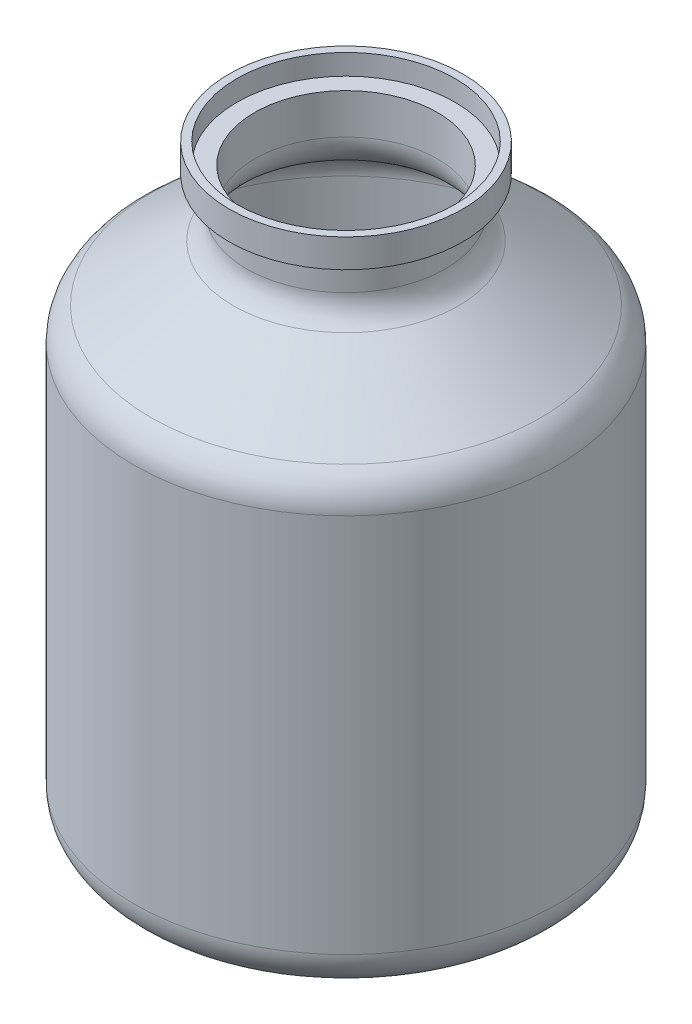
ISO-10303-21;
HEADER;
FILE_DESCRIPTION(('STEP AP214'),'2;1');
FILE_NAME('part.step','',(''),(''),'','','');
FILE_SCHEMA(('AUTOMOTIVE_DESIGN { 1 0 10303 214 1 1 1 1 }'));
ENDSEC;
DATA;
#1=APPLICATION_CONTEXT('core data for automotive mechanical design processes');
#2=APPLICATION_PROTOCOL_DEFINITION('international standard','automotive_design',2000,#1);
#3=PRODUCT_CONTEXT('',#1,'mechanical');
#4=PRODUCT('Part','Part','',(#3));
#5=PRODUCT_RELATED_PRODUCT_CATEGORY('part','',(#4));
#6=PRODUCT_DEFINITION_FORMATION('','',#4);
#7=PRODUCT_DEFINITION_CONTEXT('part definition',#1,'design');
#8=PRODUCT_DEFINITION('design','',#6,#7);
#9=PRODUCT_DEFINITION_SHAPE('','',#8);
#10=(LENGTH_UNIT() NAMED_UNIT(*) SI_UNIT(.MILLI.,.METRE.));
#11=(NAMED_UNIT(*) PLANE_ANGLE_UNIT() SI_UNIT($,.RADIAN.));
#12=(NAMED_UNIT(*) SI_UNIT($,.STERADIAN.) SOLID_ANGLE_UNIT());
#13=UNCERTAINTY_MEASURE_WITH_UNIT(LENGTH_MEASURE(1.E-05),#10,'distance_accuracy_value','');
#14=(GEOMETRIC_REPRESENTATION_CONTEXT(3) GLOBAL_UNCERTAINTY_ASSIGNED_CONTEXT((#13)) GLOBAL_UNIT_ASSIGNED_CONTEXT((#10,
#11,#12)) REPRESENTATION_CONTEXT('',''));
#15=CARTESIAN_POINT('',(0.,0.,0.));
#16=DIRECTION('',(0.,0.,1.));
#17=DIRECTION('',(1.,0.,0.));
#18=AXIS2_PLACEMENT_3D('',#15,#16,#17);
#19=CARTESIAN_POINT('',(0.,12.7,0.));
#20=DIRECTION('',(0.,1.,0.));
#21=DIRECTION('',(0.,0.,1.));
#22=AXIS2_PLACEMENT_3D('',#19,#20,#21);
#23=TOROIDAL_SURFACE('',#22,55.8506106293866,12.7);
#24=CARTESIAN_POINT('',(0.,12.7,0.));
#25=DIRECTION('',(0.,1.,0.));
#26=DIRECTION('',(0.,0.,1.));
#27=AXIS2_PLACEMENT_3D('',#24,#25,#26);
#28=CIRCLE('',#27,68.5506106293866);
#29=CARTESIAN_POINT('',(0.,12.7,68.5506106293866));
#30=VERTEX_POINT('',#29);
#31=EDGE_CURVE('E10',#30,#30,#28,.T.);
#32=ORIENTED_EDGE('',*,*,#31,.F.);
#33=EDGE_LOOP('',(#32));
#34=FACE_BOUND('',#33,.T.);
#35=CARTESIAN_POINT('',(0.,0.,0.));
#36=DIRECTION('',(0.,1.,0.));
#37=DIRECTION('',(0.,0.,1.));
#38=AXIS2_PLACEMENT_3D('',#35,#36,#37);
#39=CIRCLE('',#38,55.8506106293866);
#40=CARTESIAN_POINT('',(0.,0.,55.8506106293866));
#41=VERTEX_POINT('',#40);
#42=EDGE_CURVE('E69',#41,#41,#39,.T.);
#43=ORIENTED_EDGE('',*,*,#42,.T.);
#44=EDGE_LOOP('',(#43));
#45=FACE_BOUND('',#44,.T.);
#46=ADVANCED_FACE('F31',(#34,#45),#23,.T.);
#47=CARTESIAN_POINT('',(0.,191.88999199796,0.));
#48=DIRECTION('',(0.,1.,0.));
#49=DIRECTION('',(0.,0.,1.));
#50=AXIS2_PLACEMENT_3D('',#47,#48,#49);
#51=CYLINDRICAL_SURFACE('',#50,68.5506106293866);
#52=CARTESIAN_POINT('',(0.,135.537090780889,0.));
#53=DIRECTION('',(0.,1.,0.));
#54=DIRECTION('',(0.,0.,1.));
#55=AXIS2_PLACEMENT_3D('',#52,#53,#54);
#56=CIRCLE('',#55,68.5506106293866);
#57=CARTESIAN_POINT('',(0.,135.537090780889,68.5506106293866));
#58=VERTEX_POINT('',#57);
#59=EDGE_CURVE('E37',#58,#58,#56,.T.);
#60=ORIENTED_EDGE('',*,*,#59,.F.);
#61=EDGE_LOOP('',(#60));
#62=FACE_BOUND('',#61,.T.);
#63=ORIENTED_EDGE('',*,*,#31,.T.);
#64=EDGE_LOOP('',(#63));
#65=FACE_BOUND('',#64,.T.);
#66=ADVANCED_FACE('F114',(#62,#65),#51,.T.);
#67=CARTESIAN_POINT('',(0.,135.537090780889,0.));
#68=DIRECTION('',(0.,1.,0.));
#69=DIRECTION('',(0.,0.,1.));
#70=AXIS2_PLACEMENT_3D('',#67,#68,#69);
#71=TOROIDAL_SURFACE('',#70,55.8506106293866,12.7);
#72=CARTESIAN_POINT('',(0.,146.041145392436,0.));
#73=DIRECTION('',(0.,1.,0.));
#74=DIRECTION('',(0.,0.,1.));
#75=AXIS2_PLACEMENT_3D('',#72,#73,#74);
#76=CIRCLE('',#75,62.9888762953326);
#77=CARTESIAN_POINT('',(0.,146.041145392436,62.9888762953326));
#78=VERTEX_POINT('',#77);
#79=EDGE_CURVE('E41',#78,#78,#76,.T.);
#80=ORIENTED_EDGE('',*,*,#79,.F.);
#81=EDGE_LOOP('',(#80));
#82=FACE_BOUND('',#81,.T.);
#83=ORIENTED_EDGE('',*,*,#59,.T.);
#84=EDGE_LOOP('',(#83));
#85=FACE_BOUND('',#84,.T.);
#86=ADVANCED_FACE('F119',(#82,#85),#71,.T.);
#87=CARTESIAN_POINT('',(0.,146.041145392436,0.));
#88=DIRECTION('',(0.,-1.,0.));
#89=DIRECTION('',(0.,0.,-1.));
#90=AXIS2_PLACEMENT_3D('',#87,#88,#89);
#91=CONICAL_SURFACE('',#90,62.9888762953326,0.973912118745665);
#92=CARTESIAN_POINT('',(0.,164.092378592853,0.));
#93=DIRECTION('',(0.,1.,0.));
#94=DIRECTION('',(0.,0.,1.));
#95=AXIS2_PLACEMENT_3D('',#92,#93,#94);
#96=CIRCLE('',#95,36.4262421463226);
#97=CARTESIAN_POINT('',(0.,164.092378592853,36.4262421463226));
#98=VERTEX_POINT('',#97);
#99=EDGE_CURVE('E45',#98,#98,#96,.T.);
#100=ORIENTED_EDGE('',*,*,#99,.F.);
#101=EDGE_LOOP('',(#100));
#102=FACE_BOUND('',#101,.T.);
#103=ORIENTED_EDGE('',*,*,#79,.T.);
#104=EDGE_LOOP('',(#103));
#105=FACE_BOUND('',#104,.T.);
#106=ADVANCED_FACE('F124',(#102,#105),#91,.T.);
#107=CARTESIAN_POINT('',(0.,172.244930881121,0.));
#108=DIRECTION('',(0.,1.,0.));
#109=DIRECTION('',(0.,0.,1.));
#110=AXIS2_PLACEMENT_3D('',#107,#108,#109);
#111=TOROIDAL_SURFACE('',#110,41.9664917205388,9.85689982487104);
#112=CARTESIAN_POINT('',(0.,172.244930881121,0.));
#113=DIRECTION('',(0.,1.,0.));
#114=DIRECTION('',(0.,0.,1.));
#115=AXIS2_PLACEMENT_3D('',#112,#113,#114);
#116=CIRCLE('',#115,32.1095918956678);
#117=CARTESIAN_POINT('',(0.,172.244930881121,32.1095918956678));
#118=VERTEX_POINT('',#117);
#119=EDGE_CURVE('E50',#118,#118,#116,.T.);
#120=ORIENTED_EDGE('',*,*,#119,.F.);
#121=EDGE_LOOP('',(#120));
#122=FACE_BOUND('',#121,.T.);
#123=ORIENTED_EDGE('',*,*,#99,.T.);
#124=EDGE_LOOP('',(#123));
#125=FACE_BOUND('',#124,.T.);
#126=ADVANCED_FACE('F130',(#122,#125),#111,.F.);
#127=CARTESIAN_POINT('',(0.,191.88999199796,0.));
#128=DIRECTION('',(0.,1.,0.));
#129=DIRECTION('',(0.,0.,1.));
#130=AXIS2_PLACEMENT_3D('',#127,#128,#129);
#131=CYLINDRICAL_SURFACE('',#130,32.1095918956678);
#132=CARTESIAN_POINT('',(0.,182.693006016334,0.));
#133=DIRECTION('',(0.,1.,0.));
#134=DIRECTION('',(0.,0.,1.));
#135=AXIS2_PLACEMENT_3D('',#132,#133,#134);
#136=CIRCLE('',#135,32.1095918956678);
#137=CARTESIAN_POINT('',(0.,182.693006016334,32.1095918956678));
#138=VERTEX_POINT('',#137);
#139=EDGE_CURVE('E53',#138,#138,#136,.T.);
#140=ORIENTED_EDGE('',*,*,#139,.F.);
#141=EDGE_LOOP('',(#140));
#142=FACE_BOUND('',#141,.T.);
#143=ORIENTED_EDGE('',*,*,#119,.T.);
#144=EDGE_LOOP('',(#143));
#145=FACE_BOUND('',#144,.T.);
#146=ADVANCED_FACE('F134',(#142,#145),#131,.T.);
#147=CARTESIAN_POINT('',(32.1095918956678,182.693006016334,0.));
#148=DIRECTION('',(0.,1.,0.));
#149=DIRECTION('',(0.,0.,1.));
#150=AXIS2_PLACEMENT_3D('',#147,#148,#149);
#151=PLANE('',#150);
#152=CARTESIAN_POINT('',(0.,182.693006016334,0.));
#153=DIRECTION('',(0.,1.,0.));
#154=DIRECTION('',(0.,0.,1.));
#155=AXIS2_PLACEMENT_3D('',#152,#153,#154);
#156=CIRCLE('',#155,37.8125387824389);
#157=CARTESIAN_POINT('',(0.,182.693006016334,37.8125387824389));
#158=VERTEX_POINT('',#157);
#159=EDGE_CURVE('E56',#158,#158,#156,.T.);
#160=ORIENTED_EDGE('',*,*,#159,.F.);
#161=EDGE_LOOP('',(#160));
#162=FACE_BOUND('',#161,.T.);
#163=ORIENTED_EDGE('',*,*,#139,.T.);
#164=EDGE_LOOP('',(#163));
#165=FACE_BOUND('',#164,.T.);
#166=ADVANCED_FACE('F138',(#162,#165),#151,.F.);
#167=CARTESIAN_POINT('',(0.,191.88999199796,0.));
#168=DIRECTION('',(0.,1.,0.));
#169=DIRECTION('',(0.,0.,1.));
#170=AXIS2_PLACEMENT_3D('',#167,#168,#169);
#171=CYLINDRICAL_SURFACE('',#170,37.8125387824389);
#172=CARTESIAN_POINT('',(0.,191.88999199796,0.));
#173=DIRECTION('',(0.,1.,0.));
#174=DIRECTION('',(0.,0.,1.));
#175=AXIS2_PLACEMENT_3D('',#172,#173,#174);
#176=CIRCLE('',#175,37.8125387824389);
#177=CARTESIAN_POINT('',(0.,191.88999199796,37.8125387824389));
#178=VERTEX_POINT('',#177);
#179=EDGE_CURVE('E59',#178,#178,#176,.T.);
#180=ORIENTED_EDGE('',*,*,#179,.F.);
#181=EDGE_LOOP('',(#180));
#182=FACE_BOUND('',#181,.T.);
#183=ORIENTED_EDGE('',*,*,#159,.T.);
#184=EDGE_LOOP('',(#183));
#185=FACE_BOUND('',#184,.T.);
#186=ADVANCED_FACE('F142',(#182,#185),#171,.T.);
#187=CARTESIAN_POINT('',(37.8125387824389,191.88999199796,0.));
#188=DIRECTION('',(0.,-1.,0.));
#189=DIRECTION('',(0.,0.,-1.));
#190=AXIS2_PLACEMENT_3D('',#187,#188,#189);
#191=PLANE('',#190);
#192=CARTESIAN_POINT('',(0.,191.88999199796,0.));
#193=DIRECTION('',(0.,-1.,0.));
#194=DIRECTION('',(0.,0.,-1.));
#195=AXIS2_PLACEMENT_3D('',#192,#193,#194);
#196=CIRCLE('',#195,35.2725387824389);
#197=CARTESIAN_POINT('',(0.,191.88999199796,-35.2725387824389));
#198=VERTEX_POINT('',#197);
#199=EDGE_CURVE('E63',#198,#198,#196,.F.);
#200=ORIENTED_EDGE('',*,*,#199,.F.);
#201=EDGE_LOOP('',(#200));
#202=FACE_BOUND('',#201,.T.);
#203=ORIENTED_EDGE('',*,*,#179,.T.);
#204=EDGE_LOOP('',(#203));
#205=FACE_BOUND('',#204,.T.);
#206=ADVANCED_FACE('F98',(#202,#205),#191,.F.);
#207=CARTESIAN_POINT('',(0.,0.,0.));
#208=DIRECTION('',(0.,1.,0.));
#209=DIRECTION('',(0.,0.,1.));
#210=AXIS2_PLACEMENT_3D('',#207,#208,#209);
#211=CYLINDRICAL_SURFACE('',#210,55.8506106293866);
#212=ORIENTED_EDGE('',*,*,#42,.F.);
#213=EDGE_LOOP('',(#212));
#214=FACE_BOUND('',#213,.T.);
#215=CARTESIAN_POINT('',(0.,2.54,0.));
#216=DIRECTION('',(0.,1.,0.));
#217=DIRECTION('',(0.,0.,1.));
#218=AXIS2_PLACEMENT_3D('',#215,#216,#217);
#219=CIRCLE('',#218,55.8506106293866);
#220=CARTESIAN_POINT('',(0.,2.54,55.8506106293866));
#221=VERTEX_POINT('',#220);
#222=EDGE_CURVE('E62',#221,#221,#219,.T.);
#223=ORIENTED_EDGE('',*,*,#222,.T.);
#224=EDGE_LOOP('',(#223));
#225=FACE_BOUND('',#224,.T.);
#226=ADVANCED_FACE('F94',(#214,#225),#211,.F.);
#227=CARTESIAN_POINT('',(0.,12.7,0.));
#228=DIRECTION('',(0.,1.,0.));
#229=DIRECTION('',(0.,0.,1.));
#230=AXIS2_PLACEMENT_3D('',#227,#228,#229);
#231=TOROIDAL_SURFACE('',#230,55.8506106293866,10.16);
#232=CARTESIAN_POINT('',(0.,12.7,0.));
#233=DIRECTION('',(0.,1.,0.));
#234=DIRECTION('',(0.,0.,1.));
#235=AXIS2_PLACEMENT_3D('',#232,#233,#234);
#236=CIRCLE('',#235,66.0106106293866);
#237=CARTESIAN_POINT('',(0.,12.7,66.0106106293866));
#238=VERTEX_POINT('',#237);
#239=EDGE_CURVE('E87',#238,#238,#236,.T.);
#240=ORIENTED_EDGE('',*,*,#239,.T.);
#241=EDGE_LOOP('',(#240));
#242=FACE_BOUND('',#241,.T.);
#243=ORIENTED_EDGE('',*,*,#222,.F.);
#244=EDGE_LOOP('',(#243));
#245=FACE_BOUND('',#244,.T.);
#246=ADVANCED_FACE('F97',(#242,#245),#231,.F.);
#247=CARTESIAN_POINT('',(0.,191.88999199796,0.));
#248=DIRECTION('',(0.,1.,0.));
#249=DIRECTION('',(0.,0.,1.));
#250=AXIS2_PLACEMENT_3D('',#247,#248,#249);
#251=CYLINDRICAL_SURFACE('',#250,66.0106106293866);
#252=CARTESIAN_POINT('',(0.,135.537090780889,0.));
#253=DIRECTION('',(0.,1.,0.));
#254=DIRECTION('',(0.,0.,1.));
#255=AXIS2_PLACEMENT_3D('',#252,#253,#254);
#256=CIRCLE('',#255,66.0106106293866);
#257=CARTESIAN_POINT('',(0.,135.537090780889,66.0106106293866));
#258=VERTEX_POINT('',#257);
#259=EDGE_CURVE('E84',#258,#258,#256,.T.);
#260=ORIENTED_EDGE('',*,*,#259,.T.);
#261=EDGE_LOOP('',(#260));
#262=FACE_BOUND('',#261,.T.);
#263=ORIENTED_EDGE('',*,*,#239,.F.);
#264=EDGE_LOOP('',(#263));
#265=FACE_BOUND('',#264,.T.);
#266=ADVANCED_FACE('F103',(#262,#265),#251,.F.);
#267=CARTESIAN_POINT('',(0.,135.537090780889,0.));
#268=DIRECTION('',(0.,1.,0.));
#269=DIRECTION('',(0.,0.,1.));
#270=AXIS2_PLACEMENT_3D('',#267,#268,#269);
#271=TOROIDAL_SURFACE('',#270,55.8506106293866,10.16);
#272=CARTESIAN_POINT('',(0.,143.940334470127,0.));
#273=DIRECTION('',(0.,-1.,0.));
#274=DIRECTION('',(0.,0.,-1.));
#275=AXIS2_PLACEMENT_3D('',#272,#273,#274);
#276=CIRCLE('',#275,61.5612231621434);
#277=CARTESIAN_POINT('',(0.,143.940334470127,-61.5612231621434));
#278=VERTEX_POINT('',#277);
#279=EDGE_CURVE('E81',#278,#278,#276,.F.);
#280=ORIENTED_EDGE('',*,*,#279,.T.);
#281=EDGE_LOOP('',(#280));
#282=FACE_BOUND('',#281,.T.);
#283=ORIENTED_EDGE('',*,*,#259,.F.);
#284=EDGE_LOOP('',(#283));
#285=FACE_BOUND('',#284,.T.);
#286=ADVANCED_FACE('F110',(#282,#285),#271,.F.);
#287=CARTESIAN_POINT('',(0.,143.940334470127,0.));
#288=DIRECTION('',(0.,-1.,0.));
#289=DIRECTION('',(0.,0.,-1.));
#290=AXIS2_PLACEMENT_3D('',#287,#288,#289);
#291=CONICAL_SURFACE('',#290,61.5612231621434,0.973912118745665);
#292=CARTESIAN_POINT('',(0.,161.991567670544,0.));
#293=DIRECTION('',(0.,1.,0.));
#294=DIRECTION('',(0.,0.,1.));
#295=AXIS2_PLACEMENT_3D('',#292,#293,#294);
#296=CIRCLE('',#295,34.9985890131334);
#297=CARTESIAN_POINT('',(0.,161.991567670544,34.9985890131334));
#298=VERTEX_POINT('',#297);
#299=EDGE_CURVE('E78',#298,#298,#296,.T.);
#300=ORIENTED_EDGE('',*,*,#299,.T.);
#301=EDGE_LOOP('',(#300));
#302=FACE_BOUND('',#301,.T.);
#303=ORIENTED_EDGE('',*,*,#279,.F.);
#304=EDGE_LOOP('',(#303));
#305=FACE_BOUND('',#304,.T.);
#306=ADVANCED_FACE('F165',(#302,#305),#291,.F.);
#307=CARTESIAN_POINT('',(0.,172.244930881121,0.));
#308=DIRECTION('',(0.,1.,0.));
#309=DIRECTION('',(0.,0.,1.));
#310=AXIS2_PLACEMENT_3D('',#307,#308,#309);
#311=TOROIDAL_SURFACE('',#310,41.9664917205388,12.396899824871);
#312=CARTESIAN_POINT('',(0.,172.244930881121,0.));
#313=DIRECTION('',(0.,1.,0.));
#314=DIRECTION('',(0.,0.,1.));
#315=AXIS2_PLACEMENT_3D('',#312,#313,#314);
#316=CIRCLE('',#315,29.5695918956678);
#317=CARTESIAN_POINT('',(0.,172.244930881121,29.5695918956678));
#318=VERTEX_POINT('',#317);
#319=EDGE_CURVE('E75',#318,#318,#316,.T.);
#320=ORIENTED_EDGE('',*,*,#319,.T.);
#321=EDGE_LOOP('',(#320));
#322=FACE_BOUND('',#321,.T.);
#323=ORIENTED_EDGE('',*,*,#299,.F.);
#324=EDGE_LOOP('',(#323));
#325=FACE_BOUND('',#324,.T.);
#326=ADVANCED_FACE('F161',(#322,#325),#311,.T.);
#327=CARTESIAN_POINT('',(0.,191.88999199796,0.));
#328=DIRECTION('',(0.,1.,0.));
#329=DIRECTION('',(0.,0.,1.));
#330=AXIS2_PLACEMENT_3D('',#327,#328,#329);
#331=CYLINDRICAL_SURFACE('',#330,29.5695918956678);
#332=CARTESIAN_POINT('',(0.,185.233006016334,0.));
#333=DIRECTION('',(0.,1.,0.));
#334=DIRECTION('',(0.,0.,1.));
#335=AXIS2_PLACEMENT_3D('',#332,#333,#334);
#336=CIRCLE('',#335,29.5695918956678);
#337=CARTESIAN_POINT('',(0.,185.233006016334,29.5695918956678));
#338=VERTEX_POINT('',#337);
#339=EDGE_CURVE('E72',#338,#338,#336,.T.);
#340=ORIENTED_EDGE('',*,*,#339,.T.);
#341=EDGE_LOOP('',(#340));
#342=FACE_BOUND('',#341,.T.);
#343=ORIENTED_EDGE('',*,*,#319,.F.);
#344=EDGE_LOOP('',(#343));
#345=FACE_BOUND('',#344,.T.);
#346=ADVANCED_FACE('F157',(#342,#345),#331,.F.);
#347=CARTESIAN_POINT('',(32.1095918956678,185.233006016334,0.));
#348=DIRECTION('',(0.,1.,0.));
#349=DIRECTION('',(0.,0.,1.));
#350=AXIS2_PLACEMENT_3D('',#347,#348,#349);
#351=PLANE('',#350);
#352=CARTESIAN_POINT('',(0.,185.233006016334,0.));
#353=DIRECTION('',(0.,1.,0.));
#354=DIRECTION('',(0.,0.,1.));
#355=AXIS2_PLACEMENT_3D('',#352,#353,#354);
#356=CIRCLE('',#355,35.2725387824389);
#357=CARTESIAN_POINT('',(0.,185.233006016334,35.2725387824389));
#358=VERTEX_POINT('',#357);
#359=EDGE_CURVE('E66',#358,#358,#356,.T.);
#360=ORIENTED_EDGE('',*,*,#359,.T.);
#361=EDGE_LOOP('',(#360));
#362=FACE_BOUND('',#361,.T.);
#363=ORIENTED_EDGE('',*,*,#339,.F.);
#364=EDGE_LOOP('',(#363));
#365=FACE_BOUND('',#364,.T.);
#366=ADVANCED_FACE('F153',(#362,#365),#351,.T.);
#367=CARTESIAN_POINT('',(0.,191.88999199796,0.));
#368=DIRECTION('',(0.,1.,0.));
#369=DIRECTION('',(0.,0.,1.));
#370=AXIS2_PLACEMENT_3D('',#367,#368,#369);
#371=CYLINDRICAL_SURFACE('',#370,35.2725387824389);
#372=ORIENTED_EDGE('',*,*,#199,.T.);
#373=EDGE_LOOP('',(#372));
#374=FACE_BOUND('',#373,.T.);
#375=ORIENTED_EDGE('',*,*,#359,.F.);
#376=EDGE_LOOP('',(#375));
#377=FACE_BOUND('',#376,.T.);
#378=ADVANCED_FACE('F150',(#374,#377),#371,.F.);
#379=CLOSED_SHELL('',(#46,#66,#86,#106,#126,#146,#166,#186,#206,#226,#246,#266,#286,#306,#326,
#346,#366,#378));
#380=MANIFOLD_SOLID_BREP('B2',#379);
#381=ADVANCED_BREP_SHAPE_REPRESENTATION('',(#18,#380),#14);
#382=SHAPE_DEFINITION_REPRESENTATION(#9,#381);
ENDSEC;
END-ISO-10303-21;
